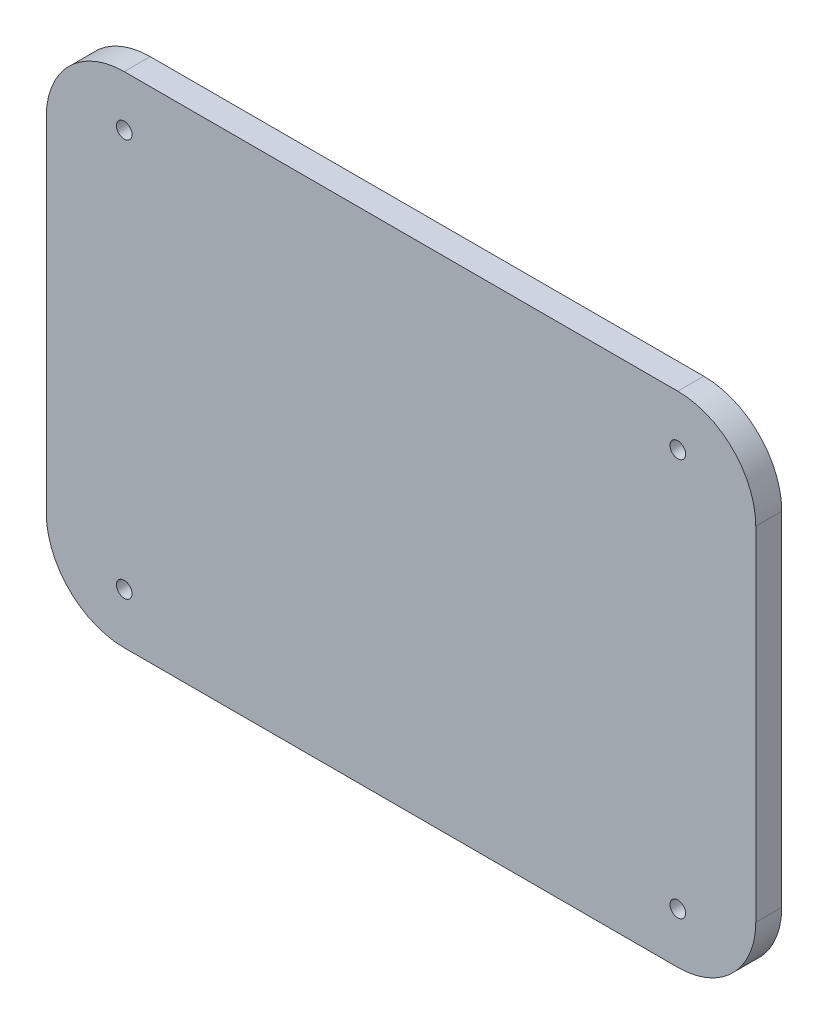
ISO-10303-21;
HEADER;
FILE_DESCRIPTION(('STEP AP214'),'2;1');
FILE_NAME('part.step','',(''),(''),'','','');
FILE_SCHEMA(('AUTOMOTIVE_DESIGN { 1 0 10303 214 1 1 1 1 }'));
ENDSEC;
DATA;
#1=APPLICATION_CONTEXT('core data for automotive mechanical design processes');
#2=APPLICATION_PROTOCOL_DEFINITION('international standard','automotive_design',2000,#1);
#3=PRODUCT_CONTEXT('',#1,'mechanical');
#4=PRODUCT('Part','Part','',(#3));
#5=PRODUCT_RELATED_PRODUCT_CATEGORY('part','',(#4));
#6=PRODUCT_DEFINITION_FORMATION('','',#4);
#7=PRODUCT_DEFINITION_CONTEXT('part definition',#1,'design');
#8=PRODUCT_DEFINITION('design','',#6,#7);
#9=PRODUCT_DEFINITION_SHAPE('','',#8);
#10=(LENGTH_UNIT() NAMED_UNIT(*) SI_UNIT(.MILLI.,.METRE.));
#11=(NAMED_UNIT(*) PLANE_ANGLE_UNIT() SI_UNIT($,.RADIAN.));
#12=(NAMED_UNIT(*) SI_UNIT($,.STERADIAN.) SOLID_ANGLE_UNIT());
#13=UNCERTAINTY_MEASURE_WITH_UNIT(LENGTH_MEASURE(1.E-05),#10,'distance_accuracy_value','');
#14=(GEOMETRIC_REPRESENTATION_CONTEXT(3) GLOBAL_UNCERTAINTY_ASSIGNED_CONTEXT((#13)) GLOBAL_UNIT_ASSIGNED_CONTEXT((#10,
#11,#12)) REPRESENTATION_CONTEXT('',''));
#15=CARTESIAN_POINT('',(0.,0.,0.));
#16=DIRECTION('',(0.,0.,1.));
#17=DIRECTION('',(1.,0.,0.));
#18=AXIS2_PLACEMENT_3D('',#15,#16,#17);
#19=CARTESIAN_POINT('',(891.19463685082,1084.14314030027,5.));
#20=DIRECTION('',(0.,0.,1.));
#21=DIRECTION('',(1.,0.,0.));
#22=AXIS2_PLACEMENT_3D('',#19,#20,#21);
#23=PLANE('',#22);
#24=CARTESIAN_POINT('',(891.19463685082,1012.89314030027,5.));
#25=DIRECTION('',(0.,0.,1.));
#26=DIRECTION('',(1.,0.,0.));
#27=AXIS2_PLACEMENT_3D('',#24,#25,#26);
#28=CIRCLE('',#27,1.50000000000011);
#29=CARTESIAN_POINT('',(892.69463685082,1012.89314030027,5.));
#30=VERTEX_POINT('',#29);
#31=EDGE_CURVE('E222',#30,#30,#28,.T.);
#32=ORIENTED_EDGE('',*,*,#31,.F.);
#33=EDGE_LOOP('',(#32));
#34=FACE_BOUND('',#33,.T.);
#35=CARTESIAN_POINT('',(784.69463685082,1089.39314030027,5.));
#36=DIRECTION('',(0.,0.,1.));
#37=DIRECTION('',(1.,0.,0.));
#38=AXIS2_PLACEMENT_3D('',#35,#36,#37);
#39=CIRCLE('',#38,1.50000000000011);
#40=CARTESIAN_POINT('',(786.19463685082,1089.39314030027,5.));
#41=VERTEX_POINT('',#40);
#42=EDGE_CURVE('E150',#41,#41,#39,.T.);
#43=ORIENTED_EDGE('',*,*,#42,.F.);
#44=EDGE_LOOP('',(#43));
#45=FACE_BOUND('',#44,.T.);
#46=DIRECTION('',(-1.,0.,0.));
#47=VECTOR('',#46,1.);
#48=CARTESIAN_POINT('',(784.69463685082,1099.14314030027,5.));
#49=LINE('',#48,#47);
#50=CARTESIAN_POINT('',(891.19463685082,1099.14314030027,5.));
#51=VERTEX_POINT('',#50);
#52=CARTESIAN_POINT('',(784.69463685082,1099.14314030027,5.));
#53=VERTEX_POINT('',#52);
#54=EDGE_CURVE('E57',#51,#53,#49,.T.);
#55=ORIENTED_EDGE('',*,*,#54,.T.);
#56=CARTESIAN_POINT('',(784.69463685082,1084.14314030027,5.));
#57=DIRECTION('',(0.,0.,1.));
#58=DIRECTION('',(1.,0.,0.));
#59=AXIS2_PLACEMENT_3D('',#56,#57,#58);
#60=CIRCLE('',#59,15.0000000000003);
#61=CARTESIAN_POINT('',(769.69463685082,1084.14314030027,5.));
#62=VERTEX_POINT('',#61);
#63=EDGE_CURVE('E102',#53,#62,#60,.T.);
#64=ORIENTED_EDGE('',*,*,#63,.T.);
#65=DIRECTION('',(0.,-1.,0.));
#66=VECTOR('',#65,1.);
#67=CARTESIAN_POINT('',(769.69463685082,1084.14314030027,5.));
#68=LINE('',#67,#66);
#69=CARTESIAN_POINT('',(769.69463685082,1018.14314030027,5.));
#70=VERTEX_POINT('',#69);
#71=EDGE_CURVE('E188',#62,#70,#68,.T.);
#72=ORIENTED_EDGE('',*,*,#71,.T.);
#73=CARTESIAN_POINT('',(784.69463685082,1018.14314030027,5.));
#74=DIRECTION('',(0.,0.,1.));
#75=DIRECTION('',(1.,0.,0.));
#76=AXIS2_PLACEMENT_3D('',#73,#74,#75);
#77=CIRCLE('',#76,15.0000000000002);
#78=CARTESIAN_POINT('',(784.69463685082,1003.14314030027,5.));
#79=VERTEX_POINT('',#78);
#80=EDGE_CURVE('E200',#70,#79,#77,.T.);
#81=ORIENTED_EDGE('',*,*,#80,.T.);
#82=DIRECTION('',(1.,0.,0.));
#83=VECTOR('',#82,1.);
#84=CARTESIAN_POINT('',(891.19463685082,1003.14314030027,5.));
#85=LINE('',#84,#83);
#86=CARTESIAN_POINT('',(891.19463685082,1003.14314030027,5.));
#87=VERTEX_POINT('',#86);
#88=EDGE_CURVE('E122',#79,#87,#85,.T.);
#89=ORIENTED_EDGE('',*,*,#88,.T.);
#90=CARTESIAN_POINT('',(891.19463685082,1018.14314030027,5.));
#91=DIRECTION('',(0.,0.,1.));
#92=DIRECTION('',(1.,0.,0.));
#93=AXIS2_PLACEMENT_3D('',#90,#91,#92);
#94=CIRCLE('',#93,15.0000000000003);
#95=CARTESIAN_POINT('',(906.19463685082,1018.14314030027,5.));
#96=VERTEX_POINT('',#95);
#97=EDGE_CURVE('E116',#87,#96,#94,.T.);
#98=ORIENTED_EDGE('',*,*,#97,.T.);
#99=DIRECTION('',(0.,1.,0.));
#100=VECTOR('',#99,1.);
#101=CARTESIAN_POINT('',(906.19463685082,1084.14314030027,5.));
#102=LINE('',#101,#100);
#103=CARTESIAN_POINT('',(906.19463685082,1084.14314030027,5.));
#104=VERTEX_POINT('',#103);
#105=EDGE_CURVE('E120',#96,#104,#102,.T.);
#106=ORIENTED_EDGE('',*,*,#105,.T.);
#107=CARTESIAN_POINT('',(891.19463685082,1084.14314030027,5.));
#108=DIRECTION('',(0.,0.,1.));
#109=DIRECTION('',(1.,0.,0.));
#110=AXIS2_PLACEMENT_3D('',#107,#108,#109);
#111=CIRCLE('',#110,15.0000000000003);
#112=EDGE_CURVE('E139',#104,#51,#111,.T.);
#113=ORIENTED_EDGE('',*,*,#112,.T.);
#114=EDGE_LOOP('',(#55,#64,#72,#81,#89,#98,#106,#113));
#115=FACE_BOUND('',#114,.T.);
#116=CARTESIAN_POINT('',(784.69463685082,1012.89314030027,5.));
#117=DIRECTION('',(0.,0.,1.));
#118=DIRECTION('',(1.,0.,0.));
#119=AXIS2_PLACEMENT_3D('',#116,#117,#118);
#120=CIRCLE('',#119,1.50000000000011);
#121=CARTESIAN_POINT('',(786.19463685082,1012.89314030027,5.));
#122=VERTEX_POINT('',#121);
#123=EDGE_CURVE('E214',#122,#122,#120,.T.);
#124=ORIENTED_EDGE('',*,*,#123,.F.);
#125=EDGE_LOOP('',(#124));
#126=FACE_BOUND('',#125,.T.);
#127=CARTESIAN_POINT('',(891.19463685082,1089.39314030027,5.));
#128=DIRECTION('',(0.,0.,1.));
#129=DIRECTION('',(1.,0.,0.));
#130=AXIS2_PLACEMENT_3D('',#127,#128,#129);
#131=CIRCLE('',#130,1.50000000000011);
#132=CARTESIAN_POINT('',(892.69463685082,1089.39314030027,5.));
#133=VERTEX_POINT('',#132);
#134=EDGE_CURVE('E230',#133,#133,#131,.T.);
#135=ORIENTED_EDGE('',*,*,#134,.F.);
#136=EDGE_LOOP('',(#135));
#137=FACE_BOUND('',#136,.T.);
#138=ADVANCED_FACE('F39',(#34,#45,#115,#126,#137),#23,.T.);
#139=CARTESIAN_POINT('',(891.19463685082,1084.14314030027,0.));
#140=DIRECTION('',(0.,0.,1.));
#141=DIRECTION('',(1.,0.,0.));
#142=AXIS2_PLACEMENT_3D('',#139,#140,#141);
#143=PLANE('',#142);
#144=CARTESIAN_POINT('',(784.69463685082,1084.14314030027,0.));
#145=DIRECTION('',(0.,0.,1.));
#146=DIRECTION('',(1.,0.,0.));
#147=AXIS2_PLACEMENT_3D('',#144,#145,#146);
#148=CIRCLE('',#147,15.0000000000003);
#149=CARTESIAN_POINT('',(784.69463685082,1099.14314030027,0.));
#150=VERTEX_POINT('',#149);
#151=CARTESIAN_POINT('',(769.69463685082,1084.14314030027,0.));
#152=VERTEX_POINT('',#151);
#153=EDGE_CURVE('E146',#150,#152,#148,.T.);
#154=ORIENTED_EDGE('',*,*,#153,.F.);
#155=DIRECTION('',(-1.,0.,0.));
#156=VECTOR('',#155,1.);
#157=CARTESIAN_POINT('',(792.94463685082,1099.14314030027,0.));
#158=LINE('',#157,#156);
#159=CARTESIAN_POINT('',(891.19463685082,1099.14314030027,0.));
#160=VERTEX_POINT('',#159);
#161=EDGE_CURVE('E94',#160,#150,#158,.T.);
#162=ORIENTED_EDGE('',*,*,#161,.F.);
#163=CARTESIAN_POINT('',(891.19463685082,1084.14314030027,0.));
#164=DIRECTION('',(0.,0.,1.));
#165=DIRECTION('',(1.,0.,0.));
#166=AXIS2_PLACEMENT_3D('',#163,#164,#165);
#167=CIRCLE('',#166,15.0000000000003);
#168=CARTESIAN_POINT('',(906.19463685082,1084.14314030027,0.));
#169=VERTEX_POINT('',#168);
#170=EDGE_CURVE('E163',#169,#160,#167,.T.);
#171=ORIENTED_EDGE('',*,*,#170,.F.);
#172=DIRECTION('',(0.,1.,0.));
#173=VECTOR('',#172,1.);
#174=CARTESIAN_POINT('',(906.19463685082,1084.14314030027,0.));
#175=LINE('',#174,#173);
#176=CARTESIAN_POINT('',(906.19463685082,1018.14314030027,0.));
#177=VERTEX_POINT('',#176);
#178=EDGE_CURVE('E87',#177,#169,#175,.T.);
#179=ORIENTED_EDGE('',*,*,#178,.F.);
#180=CARTESIAN_POINT('',(891.19463685082,1018.14314030027,0.));
#181=DIRECTION('',(0.,0.,1.));
#182=DIRECTION('',(1.,0.,0.));
#183=AXIS2_PLACEMENT_3D('',#180,#181,#182);
#184=CIRCLE('',#183,15.0000000000003);
#185=CARTESIAN_POINT('',(891.19463685082,1003.14314030027,0.));
#186=VERTEX_POINT('',#185);
#187=EDGE_CURVE('E131',#186,#177,#184,.T.);
#188=ORIENTED_EDGE('',*,*,#187,.F.);
#189=DIRECTION('',(1.,0.,0.));
#190=VECTOR('',#189,1.);
#191=CARTESIAN_POINT('',(891.19463685082,1003.14314030027,0.));
#192=LINE('',#191,#190);
#193=CARTESIAN_POINT('',(784.69463685082,1003.14314030027,0.));
#194=VERTEX_POINT('',#193);
#195=EDGE_CURVE('E156',#194,#186,#192,.T.);
#196=ORIENTED_EDGE('',*,*,#195,.F.);
#197=CARTESIAN_POINT('',(784.69463685082,1018.14314030027,0.));
#198=DIRECTION('',(0.,0.,1.));
#199=DIRECTION('',(1.,0.,0.));
#200=AXIS2_PLACEMENT_3D('',#197,#198,#199);
#201=CIRCLE('',#200,15.0000000000002);
#202=CARTESIAN_POINT('',(769.69463685082,1018.14314030027,0.));
#203=VERTEX_POINT('',#202);
#204=EDGE_CURVE('E153',#203,#194,#201,.T.);
#205=ORIENTED_EDGE('',*,*,#204,.F.);
#206=DIRECTION('',(0.,-1.,0.));
#207=VECTOR('',#206,1.);
#208=CARTESIAN_POINT('',(769.69463685082,1084.14314030027,0.));
#209=LINE('',#208,#207);
#210=EDGE_CURVE('E149',#152,#203,#209,.T.);
#211=ORIENTED_EDGE('',*,*,#210,.F.);
#212=EDGE_LOOP('',(#154,#162,#171,#179,#188,#196,#205,#211));
#213=FACE_BOUND('',#212,.T.);
#214=CARTESIAN_POINT('',(784.69463685082,1089.39314030027,0.));
#215=DIRECTION('',(0.,0.,1.));
#216=DIRECTION('',(1.,0.,0.));
#217=AXIS2_PLACEMENT_3D('',#214,#215,#216);
#218=CIRCLE('',#217,1.50000000000011);
#219=CARTESIAN_POINT('',(786.19463685082,1089.39314030027,0.));
#220=VERTEX_POINT('',#219);
#221=EDGE_CURVE('E210',#220,#220,#218,.T.);
#222=ORIENTED_EDGE('',*,*,#221,.T.);
#223=EDGE_LOOP('',(#222));
#224=FACE_BOUND('',#223,.T.);
#225=CARTESIAN_POINT('',(784.69463685082,1012.89314030027,0.));
#226=DIRECTION('',(0.,0.,1.));
#227=DIRECTION('',(1.,0.,0.));
#228=AXIS2_PLACEMENT_3D('',#225,#226,#227);
#229=CIRCLE('',#228,1.50000000000011);
#230=CARTESIAN_POINT('',(786.19463685082,1012.89314030027,0.));
#231=VERTEX_POINT('',#230);
#232=EDGE_CURVE('E218',#231,#231,#229,.T.);
#233=ORIENTED_EDGE('',*,*,#232,.T.);
#234=EDGE_LOOP('',(#233));
#235=FACE_BOUND('',#234,.T.);
#236=CARTESIAN_POINT('',(891.19463685082,1012.89314030027,0.));
#237=DIRECTION('',(0.,0.,1.));
#238=DIRECTION('',(1.,0.,0.));
#239=AXIS2_PLACEMENT_3D('',#236,#237,#238);
#240=CIRCLE('',#239,1.50000000000011);
#241=CARTESIAN_POINT('',(892.69463685082,1012.89314030027,0.));
#242=VERTEX_POINT('',#241);
#243=EDGE_CURVE('E226',#242,#242,#240,.T.);
#244=ORIENTED_EDGE('',*,*,#243,.T.);
#245=EDGE_LOOP('',(#244));
#246=FACE_BOUND('',#245,.T.);
#247=CARTESIAN_POINT('',(891.19463685082,1089.39314030027,0.));
#248=DIRECTION('',(0.,0.,1.));
#249=DIRECTION('',(1.,0.,0.));
#250=AXIS2_PLACEMENT_3D('',#247,#248,#249);
#251=CIRCLE('',#250,1.50000000000011);
#252=CARTESIAN_POINT('',(892.69463685082,1089.39314030027,0.));
#253=VERTEX_POINT('',#252);
#254=EDGE_CURVE('E234',#253,#253,#251,.T.);
#255=ORIENTED_EDGE('',*,*,#254,.T.);
#256=EDGE_LOOP('',(#255));
#257=FACE_BOUND('',#256,.T.);
#258=ADVANCED_FACE('F190',(#213,#224,#235,#246,#257),#143,.F.);
#259=CARTESIAN_POINT('',(784.69463685082,1084.14314030027,5.));
#260=DIRECTION('',(0.,0.,-1.));
#261=DIRECTION('',(-1.,0.,0.));
#262=AXIS2_PLACEMENT_3D('',#259,#260,#261);
#263=CYLINDRICAL_SURFACE('',#262,15.0000000000003);
#264=ORIENTED_EDGE('',*,*,#153,.T.);
#265=DIRECTION('',(0.,0.,-1.));
#266=VECTOR('',#265,1.);
#267=CARTESIAN_POINT('',(769.69463685082,1084.14314030027,5.));
#268=LINE('',#267,#266);
#269=EDGE_CURVE('E49',#62,#152,#268,.T.);
#270=ORIENTED_EDGE('',*,*,#269,.F.);
#271=ORIENTED_EDGE('',*,*,#63,.F.);
#272=DIRECTION('',(0.,0.,-1.));
#273=VECTOR('',#272,1.);
#274=CARTESIAN_POINT('',(784.69463685082,1099.14314030027,5.));
#275=LINE('',#274,#273);
#276=EDGE_CURVE('E11',#53,#150,#275,.T.);
#277=ORIENTED_EDGE('',*,*,#276,.T.);
#278=EDGE_LOOP('',(#264,#270,#271,#277));
#279=FACE_BOUND('',#278,.T.);
#280=ADVANCED_FACE('F41',(#279),#263,.T.);
#281=CARTESIAN_POINT('',(769.69463685082,1084.14314030027,5.));
#282=DIRECTION('',(1.,0.,0.));
#283=DIRECTION('',(0.,1.,0.));
#284=AXIS2_PLACEMENT_3D('',#281,#282,#283);
#285=PLANE('',#284);
#286=ORIENTED_EDGE('',*,*,#210,.T.);
#287=DIRECTION('',(0.,0.,-1.));
#288=VECTOR('',#287,1.);
#289=CARTESIAN_POINT('',(769.69463685082,1018.14314030027,5.));
#290=LINE('',#289,#288);
#291=EDGE_CURVE('E178',#70,#203,#290,.T.);
#292=ORIENTED_EDGE('',*,*,#291,.F.);
#293=ORIENTED_EDGE('',*,*,#71,.F.);
#294=ORIENTED_EDGE('',*,*,#269,.T.);
#295=EDGE_LOOP('',(#286,#292,#293,#294));
#296=FACE_BOUND('',#295,.T.);
#297=ADVANCED_FACE('F186',(#296),#285,.F.);
#298=CARTESIAN_POINT('',(784.69463685082,1018.14314030027,5.));
#299=DIRECTION('',(0.,0.,-1.));
#300=DIRECTION('',(-1.,0.,0.));
#301=AXIS2_PLACEMENT_3D('',#298,#299,#300);
#302=CYLINDRICAL_SURFACE('',#301,15.0000000000002);
#303=ORIENTED_EDGE('',*,*,#204,.T.);
#304=DIRECTION('',(0.,0.,-1.));
#305=VECTOR('',#304,1.);
#306=CARTESIAN_POINT('',(784.69463685082,1003.14314030027,5.));
#307=LINE('',#306,#305);
#308=EDGE_CURVE('E174',#79,#194,#307,.T.);
#309=ORIENTED_EDGE('',*,*,#308,.F.);
#310=ORIENTED_EDGE('',*,*,#80,.F.);
#311=ORIENTED_EDGE('',*,*,#291,.T.);
#312=EDGE_LOOP('',(#303,#309,#310,#311));
#313=FACE_BOUND('',#312,.T.);
#314=ADVANCED_FACE('F195',(#313),#302,.T.);
#315=CARTESIAN_POINT('',(891.19463685082,1003.14314030027,5.));
#316=DIRECTION('',(0.,1.,0.));
#317=DIRECTION('',(-1.,0.,0.));
#318=AXIS2_PLACEMENT_3D('',#315,#316,#317);
#319=PLANE('',#318);
#320=ORIENTED_EDGE('',*,*,#195,.T.);
#321=DIRECTION('',(0.,0.,-1.));
#322=VECTOR('',#321,1.);
#323=CARTESIAN_POINT('',(891.19463685082,1003.14314030027,5.));
#324=LINE('',#323,#322);
#325=EDGE_CURVE('E133',#87,#186,#324,.T.);
#326=ORIENTED_EDGE('',*,*,#325,.F.);
#327=ORIENTED_EDGE('',*,*,#88,.F.);
#328=ORIENTED_EDGE('',*,*,#308,.T.);
#329=EDGE_LOOP('',(#320,#326,#327,#328));
#330=FACE_BOUND('',#329,.T.);
#331=ADVANCED_FACE('F198',(#330),#319,.F.);
#332=CARTESIAN_POINT('',(891.19463685082,1018.14314030027,5.));
#333=DIRECTION('',(0.,0.,-1.));
#334=DIRECTION('',(-1.,0.,0.));
#335=AXIS2_PLACEMENT_3D('',#332,#333,#334);
#336=CYLINDRICAL_SURFACE('',#335,15.0000000000003);
#337=ORIENTED_EDGE('',*,*,#187,.T.);
#338=DIRECTION('',(0.,0.,-1.));
#339=VECTOR('',#338,1.);
#340=CARTESIAN_POINT('',(906.19463685082,1018.14314030027,5.));
#341=LINE('',#340,#339);
#342=EDGE_CURVE('E128',#96,#177,#341,.T.);
#343=ORIENTED_EDGE('',*,*,#342,.F.);
#344=ORIENTED_EDGE('',*,*,#97,.F.);
#345=ORIENTED_EDGE('',*,*,#325,.T.);
#346=EDGE_LOOP('',(#337,#343,#344,#345));
#347=FACE_BOUND('',#346,.T.);
#348=ADVANCED_FACE('F129',(#347),#336,.T.);
#349=CARTESIAN_POINT('',(906.19463685082,1084.14314030027,5.));
#350=DIRECTION('',(-1.,0.,0.));
#351=DIRECTION('',(0.,-1.,0.));
#352=AXIS2_PLACEMENT_3D('',#349,#350,#351);
#353=PLANE('',#352);
#354=ORIENTED_EDGE('',*,*,#178,.T.);
#355=DIRECTION('',(0.,0.,-1.));
#356=VECTOR('',#355,1.);
#357=CARTESIAN_POINT('',(906.19463685082,1084.14314030027,5.));
#358=LINE('',#357,#356);
#359=EDGE_CURVE('E134',#104,#169,#358,.T.);
#360=ORIENTED_EDGE('',*,*,#359,.F.);
#361=ORIENTED_EDGE('',*,*,#105,.F.);
#362=ORIENTED_EDGE('',*,*,#342,.T.);
#363=EDGE_LOOP('',(#354,#360,#361,#362));
#364=FACE_BOUND('',#363,.T.);
#365=ADVANCED_FACE('F136',(#364),#353,.F.);
#366=CARTESIAN_POINT('',(891.19463685082,1084.14314030027,5.));
#367=DIRECTION('',(0.,0.,-1.));
#368=DIRECTION('',(-1.,0.,0.));
#369=AXIS2_PLACEMENT_3D('',#366,#367,#368);
#370=CYLINDRICAL_SURFACE('',#369,15.0000000000003);
#371=ORIENTED_EDGE('',*,*,#170,.T.);
#372=DIRECTION('',(0.,0.,-1.));
#373=VECTOR('',#372,1.);
#374=CARTESIAN_POINT('',(891.19463685082,1099.14314030027,5.));
#375=LINE('',#374,#373);
#376=EDGE_CURVE('E142',#51,#160,#375,.T.);
#377=ORIENTED_EDGE('',*,*,#376,.F.);
#378=ORIENTED_EDGE('',*,*,#112,.F.);
#379=ORIENTED_EDGE('',*,*,#359,.T.);
#380=EDGE_LOOP('',(#371,#377,#378,#379));
#381=FACE_BOUND('',#380,.T.);
#382=ADVANCED_FACE('F261',(#381),#370,.T.);
#383=CARTESIAN_POINT('',(792.94463685082,1099.14314030027,5.));
#384=DIRECTION('',(0.,-1.,0.));
#385=DIRECTION('',(0.,0.,-1.));
#386=AXIS2_PLACEMENT_3D('',#383,#384,#385);
#387=PLANE('',#386);
#388=ORIENTED_EDGE('',*,*,#161,.T.);
#389=ORIENTED_EDGE('',*,*,#276,.F.);
#390=ORIENTED_EDGE('',*,*,#54,.F.);
#391=ORIENTED_EDGE('',*,*,#376,.T.);
#392=EDGE_LOOP('',(#388,#389,#390,#391));
#393=FACE_BOUND('',#392,.T.);
#394=ADVANCED_FACE('F258',(#393),#387,.F.);
#395=CARTESIAN_POINT('',(784.69463685082,1089.39314030027,5.));
#396=DIRECTION('',(0.,0.,-1.));
#397=DIRECTION('',(-1.,0.,0.));
#398=AXIS2_PLACEMENT_3D('',#395,#396,#397);
#399=CYLINDRICAL_SURFACE('',#398,1.50000000000011);
#400=ORIENTED_EDGE('',*,*,#42,.T.);
#401=EDGE_LOOP('',(#400));
#402=FACE_BOUND('',#401,.T.);
#403=ORIENTED_EDGE('',*,*,#221,.F.);
#404=EDGE_LOOP('',(#403));
#405=FACE_BOUND('',#404,.T.);
#406=ADVANCED_FACE('F255',(#402,#405),#399,.F.);
#407=CARTESIAN_POINT('',(784.69463685082,1012.89314030027,5.));
#408=DIRECTION('',(0.,0.,-1.));
#409=DIRECTION('',(-1.,0.,0.));
#410=AXIS2_PLACEMENT_3D('',#407,#408,#409);
#411=CYLINDRICAL_SURFACE('',#410,1.50000000000011);
#412=ORIENTED_EDGE('',*,*,#123,.T.);
#413=EDGE_LOOP('',(#412));
#414=FACE_BOUND('',#413,.T.);
#415=ORIENTED_EDGE('',*,*,#232,.F.);
#416=EDGE_LOOP('',(#415));
#417=FACE_BOUND('',#416,.T.);
#418=ADVANCED_FACE('F339',(#414,#417),#411,.F.);
#419=CARTESIAN_POINT('',(891.19463685082,1012.89314030027,5.));
#420=DIRECTION('',(0.,0.,-1.));
#421=DIRECTION('',(-1.,0.,0.));
#422=AXIS2_PLACEMENT_3D('',#419,#420,#421);
#423=CYLINDRICAL_SURFACE('',#422,1.50000000000011);
#424=ORIENTED_EDGE('',*,*,#31,.T.);
#425=EDGE_LOOP('',(#424));
#426=FACE_BOUND('',#425,.T.);
#427=ORIENTED_EDGE('',*,*,#243,.F.);
#428=EDGE_LOOP('',(#427));
#429=FACE_BOUND('',#428,.T.);
#430=ADVANCED_FACE('F347',(#426,#429),#423,.F.);
#431=CARTESIAN_POINT('',(891.19463685082,1089.39314030027,5.));
#432=DIRECTION('',(0.,0.,-1.));
#433=DIRECTION('',(-1.,0.,0.));
#434=AXIS2_PLACEMENT_3D('',#431,#432,#433);
#435=CYLINDRICAL_SURFACE('',#434,1.50000000000011);
#436=ORIENTED_EDGE('',*,*,#134,.T.);
#437=EDGE_LOOP('',(#436));
#438=FACE_BOUND('',#437,.T.);
#439=ORIENTED_EDGE('',*,*,#254,.F.);
#440=EDGE_LOOP('',(#439));
#441=FACE_BOUND('',#440,.T.);
#442=ADVANCED_FACE('F242',(#438,#441),#435,.F.);
#443=CLOSED_SHELL('',(#138,#258,#280,#297,#314,#331,#348,#365,#382,#394,#406,#418,#430,#442));
#444=MANIFOLD_SOLID_BREP('B2',#443);
#445=ADVANCED_BREP_SHAPE_REPRESENTATION('',(#18,#444),#14);
#446=SHAPE_DEFINITION_REPRESENTATION(#9,#445);
ENDSEC;
END-ISO-10303-21;
